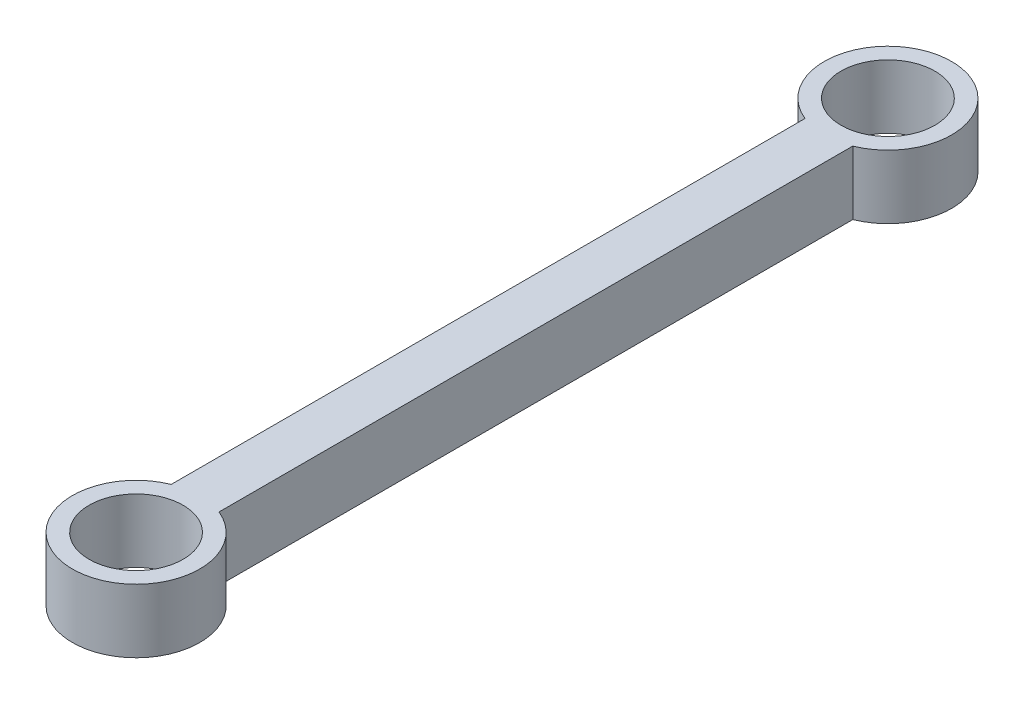
ISO-10303-21;
HEADER;
FILE_DESCRIPTION(('STEP AP214'),'2;1');
FILE_NAME('part.step','',(''),(''),'','','');
FILE_SCHEMA(('AUTOMOTIVE_DESIGN { 1 0 10303 214 1 1 1 1 }'));
ENDSEC;
DATA;
#1=APPLICATION_CONTEXT('core data for automotive mechanical design processes');
#2=APPLICATION_PROTOCOL_DEFINITION('international standard','automotive_design',2000,#1);
#3=PRODUCT_CONTEXT('',#1,'mechanical');
#4=PRODUCT('Part','Part','',(#3));
#5=PRODUCT_RELATED_PRODUCT_CATEGORY('part','',(#4));
#6=PRODUCT_DEFINITION_FORMATION('','',#4);
#7=PRODUCT_DEFINITION_CONTEXT('part definition',#1,'design');
#8=PRODUCT_DEFINITION('design','',#6,#7);
#9=PRODUCT_DEFINITION_SHAPE('','',#8);
#10=(LENGTH_UNIT() NAMED_UNIT(*) SI_UNIT(.MILLI.,.METRE.));
#11=(NAMED_UNIT(*) PLANE_ANGLE_UNIT() SI_UNIT($,.RADIAN.));
#12=(NAMED_UNIT(*) SI_UNIT($,.STERADIAN.) SOLID_ANGLE_UNIT());
#13=UNCERTAINTY_MEASURE_WITH_UNIT(LENGTH_MEASURE(1.E-05),#10,'distance_accuracy_value','');
#14=(GEOMETRIC_REPRESENTATION_CONTEXT(3) GLOBAL_UNCERTAINTY_ASSIGNED_CONTEXT((#13)) GLOBAL_UNIT_ASSIGNED_CONTEXT((#10,
#11,#12)) REPRESENTATION_CONTEXT('',''));
#15=CARTESIAN_POINT('',(0.,0.,0.));
#16=DIRECTION('',(0.,0.,1.));
#17=DIRECTION('',(1.,0.,0.));
#18=AXIS2_PLACEMENT_3D('',#15,#16,#17);
#19=CARTESIAN_POINT('',(0.,4.,-47.22));
#20=DIRECTION('',(0.,1.,0.));
#21=DIRECTION('',(0.,0.,1.));
#22=AXIS2_PLACEMENT_3D('',#19,#20,#21);
#23=PLANE('',#22);
#24=CARTESIAN_POINT('',(0.,4.,-47.22));
#25=DIRECTION('',(0.,1.,0.));
#26=DIRECTION('',(0.,0.,1.));
#27=AXIS2_PLACEMENT_3D('',#24,#25,#26);
#28=CIRCLE('',#27,2.95);
#29=CARTESIAN_POINT('',(0.,4.,-44.27));
#30=VERTEX_POINT('',#29);
#31=EDGE_CURVE('E112',#30,#30,#28,.T.);
#32=ORIENTED_EDGE('',*,*,#31,.F.);
#33=EDGE_LOOP('',(#32));
#34=FACE_BOUND('',#33,.T.);
#35=CARTESIAN_POINT('',(0.,4.,-47.22));
#36=DIRECTION('',(0.,1.,0.));
#37=DIRECTION('',(0.,0.,1.));
#38=AXIS2_PLACEMENT_3D('',#35,#36,#37);
#39=CIRCLE('',#38,4.);
#40=CARTESIAN_POINT('',(1.5,4.,-43.5119007564522));
#41=VERTEX_POINT('',#40);
#42=CARTESIAN_POINT('',(-1.5,4.,-43.5119007564522));
#43=VERTEX_POINT('',#42);
#44=EDGE_CURVE('E92',#41,#43,#39,.T.);
#45=ORIENTED_EDGE('',*,*,#44,.T.);
#46=DIRECTION('',(0.,0.,1.));
#47=VECTOR('',#46,1.);
#48=CARTESIAN_POINT('',(-1.5,4.,-43.5119007564522));
#49=LINE('',#48,#47);
#50=CARTESIAN_POINT('',(-1.49999999999999,4.,-3.70809924354783));
#51=VERTEX_POINT('',#50);
#52=EDGE_CURVE('E87',#43,#51,#49,.T.);
#53=ORIENTED_EDGE('',*,*,#52,.T.);
#54=CARTESIAN_POINT('',(0.,4.,0.));
#55=DIRECTION('',(0.,1.,0.));
#56=DIRECTION('',(0.,0.,1.));
#57=AXIS2_PLACEMENT_3D('',#54,#55,#56);
#58=CIRCLE('',#57,4.);
#59=CARTESIAN_POINT('',(1.5,4.,-3.70809924354783));
#60=VERTEX_POINT('',#59);
#61=EDGE_CURVE('E90',#51,#60,#58,.T.);
#62=ORIENTED_EDGE('',*,*,#61,.T.);
#63=DIRECTION('',(0.,0.,-1.));
#64=VECTOR('',#63,1.);
#65=CARTESIAN_POINT('',(1.5,4.,-43.5119007564522));
#66=LINE('',#65,#64);
#67=EDGE_CURVE('E57',#60,#41,#66,.T.);
#68=ORIENTED_EDGE('',*,*,#67,.T.);
#69=EDGE_LOOP('',(#45,#53,#62,#68));
#70=FACE_BOUND('',#69,.T.);
#71=CARTESIAN_POINT('',(0.,4.,0.));
#72=DIRECTION('',(0.,1.,0.));
#73=DIRECTION('',(0.,0.,1.));
#74=AXIS2_PLACEMENT_3D('',#71,#72,#73);
#75=CIRCLE('',#74,2.95);
#76=CARTESIAN_POINT('',(0.,4.,2.95));
#77=VERTEX_POINT('',#76);
#78=EDGE_CURVE('E134',#77,#77,#75,.T.);
#79=ORIENTED_EDGE('',*,*,#78,.F.);
#80=EDGE_LOOP('',(#79));
#81=FACE_BOUND('',#80,.T.);
#82=ADVANCED_FACE('F39',(#34,#70,#81),#23,.T.);
#83=CARTESIAN_POINT('',(0.,0.,-47.22));
#84=DIRECTION('',(0.,1.,0.));
#85=DIRECTION('',(0.,0.,1.));
#86=AXIS2_PLACEMENT_3D('',#83,#84,#85);
#87=PLANE('',#86);
#88=CARTESIAN_POINT('',(0.,0.,-47.22));
#89=DIRECTION('',(0.,1.,0.));
#90=DIRECTION('',(0.,0.,1.));
#91=AXIS2_PLACEMENT_3D('',#88,#89,#90);
#92=CIRCLE('',#91,4.);
#93=CARTESIAN_POINT('',(1.5,0.,-43.5119007564522));
#94=VERTEX_POINT('',#93);
#95=CARTESIAN_POINT('',(-1.5,0.,-43.5119007564522));
#96=VERTEX_POINT('',#95);
#97=EDGE_CURVE('E108',#94,#96,#92,.T.);
#98=ORIENTED_EDGE('',*,*,#97,.F.);
#99=DIRECTION('',(0.,0.,-1.));
#100=VECTOR('',#99,1.);
#101=CARTESIAN_POINT('',(1.5,0.,-43.5119007564522));
#102=LINE('',#101,#100);
#103=CARTESIAN_POINT('',(1.5,0.,-3.70809924354783));
#104=VERTEX_POINT('',#103);
#105=EDGE_CURVE('E80',#104,#94,#102,.T.);
#106=ORIENTED_EDGE('',*,*,#105,.F.);
#107=CARTESIAN_POINT('',(0.,0.,0.));
#108=DIRECTION('',(0.,1.,0.));
#109=DIRECTION('',(0.,0.,1.));
#110=AXIS2_PLACEMENT_3D('',#107,#108,#109);
#111=CIRCLE('',#110,4.);
#112=CARTESIAN_POINT('',(-1.49999999999999,0.,-3.70809924354783));
#113=VERTEX_POINT('',#112);
#114=EDGE_CURVE('E74',#113,#104,#111,.T.);
#115=ORIENTED_EDGE('',*,*,#114,.F.);
#116=DIRECTION('',(0.,0.,1.));
#117=VECTOR('',#116,1.);
#118=CARTESIAN_POINT('',(-1.5,0.,-43.5119007564522));
#119=LINE('',#118,#117);
#120=EDGE_CURVE('E97',#96,#113,#119,.T.);
#121=ORIENTED_EDGE('',*,*,#120,.F.);
#122=EDGE_LOOP('',(#98,#106,#115,#121));
#123=FACE_BOUND('',#122,.T.);
#124=CARTESIAN_POINT('',(0.,0.,-47.22));
#125=DIRECTION('',(0.,1.,0.));
#126=DIRECTION('',(0.,0.,1.));
#127=AXIS2_PLACEMENT_3D('',#124,#125,#126);
#128=CIRCLE('',#127,2.95);
#129=CARTESIAN_POINT('',(0.,0.,-44.27));
#130=VERTEX_POINT('',#129);
#131=EDGE_CURVE('E130',#130,#130,#128,.T.);
#132=ORIENTED_EDGE('',*,*,#131,.T.);
#133=EDGE_LOOP('',(#132));
#134=FACE_BOUND('',#133,.T.);
#135=CARTESIAN_POINT('',(0.,0.,0.));
#136=DIRECTION('',(0.,1.,0.));
#137=DIRECTION('',(0.,0.,1.));
#138=AXIS2_PLACEMENT_3D('',#135,#136,#137);
#139=CIRCLE('',#138,2.95);
#140=CARTESIAN_POINT('',(0.,0.,2.95));
#141=VERTEX_POINT('',#140);
#142=EDGE_CURVE('E138',#141,#141,#139,.T.);
#143=ORIENTED_EDGE('',*,*,#142,.T.);
#144=EDGE_LOOP('',(#143));
#145=FACE_BOUND('',#144,.T.);
#146=ADVANCED_FACE('F125',(#123,#134,#145),#87,.F.);
#147=CARTESIAN_POINT('',(0.,4.,-47.22));
#148=DIRECTION('',(0.,-1.,0.));
#149=DIRECTION('',(0.,0.,-1.));
#150=AXIS2_PLACEMENT_3D('',#147,#148,#149);
#151=CYLINDRICAL_SURFACE('',#150,4.);
#152=ORIENTED_EDGE('',*,*,#97,.T.);
#153=DIRECTION('',(0.,-1.,0.));
#154=VECTOR('',#153,1.);
#155=CARTESIAN_POINT('',(-1.5,4.,-43.5119007564522));
#156=LINE('',#155,#154);
#157=EDGE_CURVE('E11',#43,#96,#156,.T.);
#158=ORIENTED_EDGE('',*,*,#157,.F.);
#159=ORIENTED_EDGE('',*,*,#44,.F.);
#160=DIRECTION('',(0.,-1.,0.));
#161=VECTOR('',#160,1.);
#162=CARTESIAN_POINT('',(1.5,4.,-43.5119007564522));
#163=LINE('',#162,#161);
#164=EDGE_CURVE('E104',#41,#94,#163,.T.);
#165=ORIENTED_EDGE('',*,*,#164,.T.);
#166=EDGE_LOOP('',(#152,#158,#159,#165));
#167=FACE_BOUND('',#166,.T.);
#168=ADVANCED_FACE('F41',(#167),#151,.T.);
#169=CARTESIAN_POINT('',(-1.5,4.,-43.5119007564522));
#170=DIRECTION('',(1.,0.,0.));
#171=DIRECTION('',(0.,0.,-1.));
#172=AXIS2_PLACEMENT_3D('',#169,#170,#171);
#173=PLANE('',#172);
#174=ORIENTED_EDGE('',*,*,#120,.T.);
#175=DIRECTION('',(0.,-1.,0.));
#176=VECTOR('',#175,1.);
#177=CARTESIAN_POINT('',(-1.49999999999999,4.,-3.70809924354783));
#178=LINE('',#177,#176);
#179=EDGE_CURVE('E49',#51,#113,#178,.T.);
#180=ORIENTED_EDGE('',*,*,#179,.F.);
#181=ORIENTED_EDGE('',*,*,#52,.F.);
#182=ORIENTED_EDGE('',*,*,#157,.T.);
#183=EDGE_LOOP('',(#174,#180,#181,#182));
#184=FACE_BOUND('',#183,.T.);
#185=ADVANCED_FACE('F96',(#184),#173,.F.);
#186=CARTESIAN_POINT('',(0.,4.,0.));
#187=DIRECTION('',(0.,-1.,0.));
#188=DIRECTION('',(0.,0.,-1.));
#189=AXIS2_PLACEMENT_3D('',#186,#187,#188);
#190=CYLINDRICAL_SURFACE('',#189,4.);
#191=ORIENTED_EDGE('',*,*,#114,.T.);
#192=DIRECTION('',(0.,-1.,0.));
#193=VECTOR('',#192,1.);
#194=CARTESIAN_POINT('',(1.5,4.,-3.70809924354783));
#195=LINE('',#194,#193);
#196=EDGE_CURVE('E99',#60,#104,#195,.T.);
#197=ORIENTED_EDGE('',*,*,#196,.F.);
#198=ORIENTED_EDGE('',*,*,#61,.F.);
#199=ORIENTED_EDGE('',*,*,#179,.T.);
#200=EDGE_LOOP('',(#191,#197,#198,#199));
#201=FACE_BOUND('',#200,.T.);
#202=ADVANCED_FACE('F100',(#201),#190,.T.);
#203=CARTESIAN_POINT('',(1.5,4.,-43.5119007564522));
#204=DIRECTION('',(-1.,0.,0.));
#205=DIRECTION('',(0.,0.,1.));
#206=AXIS2_PLACEMENT_3D('',#203,#204,#205);
#207=PLANE('',#206);
#208=ORIENTED_EDGE('',*,*,#105,.T.);
#209=ORIENTED_EDGE('',*,*,#164,.F.);
#210=ORIENTED_EDGE('',*,*,#67,.F.);
#211=ORIENTED_EDGE('',*,*,#196,.T.);
#212=EDGE_LOOP('',(#208,#209,#210,#211));
#213=FACE_BOUND('',#212,.T.);
#214=ADVANCED_FACE('F122',(#213),#207,.F.);
#215=CARTESIAN_POINT('',(0.,4.,-47.22));
#216=DIRECTION('',(0.,-1.,0.));
#217=DIRECTION('',(0.,0.,-1.));
#218=AXIS2_PLACEMENT_3D('',#215,#216,#217);
#219=CYLINDRICAL_SURFACE('',#218,2.95);
#220=ORIENTED_EDGE('',*,*,#31,.T.);
#221=EDGE_LOOP('',(#220));
#222=FACE_BOUND('',#221,.T.);
#223=ORIENTED_EDGE('',*,*,#131,.F.);
#224=EDGE_LOOP('',(#223));
#225=FACE_BOUND('',#224,.T.);
#226=ADVANCED_FACE('F157',(#222,#225),#219,.F.);
#227=CARTESIAN_POINT('',(0.,4.,0.));
#228=DIRECTION('',(0.,-1.,0.));
#229=DIRECTION('',(0.,0.,-1.));
#230=AXIS2_PLACEMENT_3D('',#227,#228,#229);
#231=CYLINDRICAL_SURFACE('',#230,2.95);
#232=ORIENTED_EDGE('',*,*,#78,.T.);
#233=EDGE_LOOP('',(#232));
#234=FACE_BOUND('',#233,.T.);
#235=ORIENTED_EDGE('',*,*,#142,.F.);
#236=EDGE_LOOP('',(#235));
#237=FACE_BOUND('',#236,.T.);
#238=ADVANCED_FACE('F146',(#234,#237),#231,.F.);
#239=CLOSED_SHELL('',(#82,#146,#168,#185,#202,#214,#226,#238));
#240=MANIFOLD_SOLID_BREP('B2',#239);
#241=ADVANCED_BREP_SHAPE_REPRESENTATION('',(#18,#240),#14);
#242=SHAPE_DEFINITION_REPRESENTATION(#9,#241);
ENDSEC;
END-ISO-10303-21;
